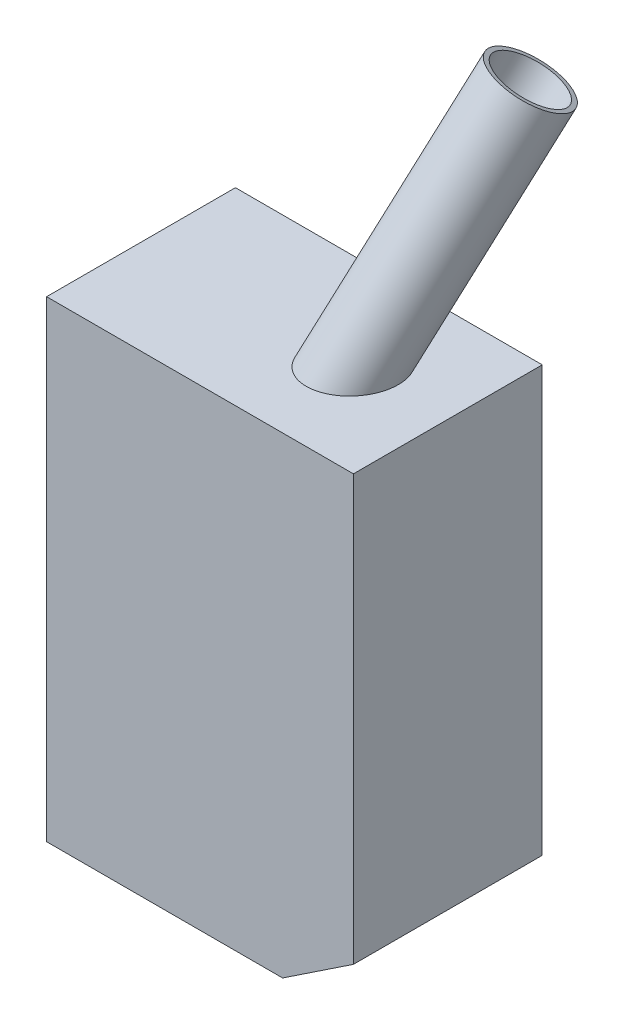
ISO-10303-21;
HEADER;
FILE_DESCRIPTION(('STEP AP214'),'2;1');
FILE_NAME('part.step','',(''),(''),'','','');
FILE_SCHEMA(('AUTOMOTIVE_DESIGN { 1 0 10303 214 1 1 1 1 }'));
ENDSEC;
DATA;
#1=APPLICATION_CONTEXT('core data for automotive mechanical design processes');
#2=APPLICATION_PROTOCOL_DEFINITION('international standard','automotive_design',2000,#1);
#3=PRODUCT_CONTEXT('',#1,'mechanical');
#4=PRODUCT('Part','Part','',(#3));
#5=PRODUCT_RELATED_PRODUCT_CATEGORY('part','',(#4));
#6=PRODUCT_DEFINITION_FORMATION('','',#4);
#7=PRODUCT_DEFINITION_CONTEXT('part definition',#1,'design');
#8=PRODUCT_DEFINITION('design','',#6,#7);
#9=PRODUCT_DEFINITION_SHAPE('','',#8);
#10=(LENGTH_UNIT() NAMED_UNIT(*) SI_UNIT(.MILLI.,.METRE.));
#11=(NAMED_UNIT(*) PLANE_ANGLE_UNIT() SI_UNIT($,.RADIAN.));
#12=(NAMED_UNIT(*) SI_UNIT($,.STERADIAN.) SOLID_ANGLE_UNIT());
#13=UNCERTAINTY_MEASURE_WITH_UNIT(LENGTH_MEASURE(1.E-05),#10,'distance_accuracy_value','');
#14=(GEOMETRIC_REPRESENTATION_CONTEXT(3) GLOBAL_UNCERTAINTY_ASSIGNED_CONTEXT((#13)) GLOBAL_UNIT_ASSIGNED_CONTEXT((#10,
#11,#12)) REPRESENTATION_CONTEXT('',''));
#15=CARTESIAN_POINT('',(0.,0.,0.));
#16=DIRECTION('',(0.,0.,1.));
#17=DIRECTION('',(1.,0.,0.));
#18=AXIS2_PLACEMENT_3D('',#15,#16,#17);
#19=CARTESIAN_POINT('',(82.55,254.,50.8));
#20=DIRECTION('',(-1.,0.,0.));
#21=DIRECTION('',(0.,0.,1.));
#22=AXIS2_PLACEMENT_3D('',#19,#20,#21);
#23=PLANE('',#22);
#24=DIRECTION('',(0.,-1.,0.));
#25=VECTOR('',#24,1.);
#26=CARTESIAN_POINT('',(82.55,254.,50.8));
#27=LINE('',#26,#25);
#28=CARTESIAN_POINT('',(82.55,254.,50.8));
#29=VERTEX_POINT('',#28);
#30=CARTESIAN_POINT('',(82.55,25.4,50.8));
#31=VERTEX_POINT('',#30);
#32=EDGE_CURVE('E233',#29,#31,#27,.T.);
#33=ORIENTED_EDGE('',*,*,#32,.T.);
#34=DIRECTION('',(0.,0.,-1.));
#35=VECTOR('',#34,1.);
#36=CARTESIAN_POINT('',(82.55,25.4,203.2));
#37=LINE('',#36,#35);
#38=CARTESIAN_POINT('',(82.55,25.4,-50.8));
#39=VERTEX_POINT('',#38);
#40=EDGE_CURVE('E215',#31,#39,#37,.T.);
#41=ORIENTED_EDGE('',*,*,#40,.T.);
#42=DIRECTION('',(0.,-1.,0.));
#43=VECTOR('',#42,1.);
#44=CARTESIAN_POINT('',(82.55,254.,-50.8));
#45=LINE('',#44,#43);
#46=CARTESIAN_POINT('',(82.55,254.,-50.8));
#47=VERTEX_POINT('',#46);
#48=EDGE_CURVE('E250',#47,#39,#45,.T.);
#49=ORIENTED_EDGE('',*,*,#48,.F.);
#50=DIRECTION('',(0.,0.,-1.));
#51=VECTOR('',#50,1.);
#52=CARTESIAN_POINT('',(82.55,254.,50.8));
#53=LINE('',#52,#51);
#54=EDGE_CURVE('E222',#29,#47,#53,.T.);
#55=ORIENTED_EDGE('',*,*,#54,.F.);
#56=EDGE_LOOP('',(#33,#41,#49,#55));
#57=FACE_BOUND('',#56,.T.);
#58=ADVANCED_FACE('F47',(#57),#23,.F.);
#59=CARTESIAN_POINT('',(-82.55,254.,-50.8));
#60=DIRECTION('',(0.,0.,1.));
#61=DIRECTION('',(1.,0.,0.));
#62=AXIS2_PLACEMENT_3D('',#59,#60,#61);
#63=PLANE('',#62);
#64=ORIENTED_EDGE('',*,*,#48,.T.);
#65=DIRECTION('',(0.832050294337844,0.554700196225229,0.));
#66=VECTOR('',#65,1.);
#67=CARTESIAN_POINT('',(44.45,0.,-50.8));
#68=LINE('',#67,#66);
#69=CARTESIAN_POINT('',(44.45,0.,-50.8));
#70=VERTEX_POINT('',#69);
#71=EDGE_CURVE('E212',#70,#39,#68,.T.);
#72=ORIENTED_EDGE('',*,*,#71,.F.);
#73=DIRECTION('',(-1.,0.,0.));
#74=VECTOR('',#73,1.);
#75=CARTESIAN_POINT('',(-82.55,0.,-50.8));
#76=LINE('',#75,#74);
#77=CARTESIAN_POINT('',(-82.55,0.,-50.8));
#78=VERTEX_POINT('',#77);
#79=EDGE_CURVE('E221',#70,#78,#76,.T.);
#80=ORIENTED_EDGE('',*,*,#79,.T.);
#81=DIRECTION('',(0.,-1.,0.));
#82=VECTOR('',#81,1.);
#83=CARTESIAN_POINT('',(-82.55,254.,-50.8));
#84=LINE('',#83,#82);
#85=CARTESIAN_POINT('',(-82.55,254.,-50.8));
#86=VERTEX_POINT('',#85);
#87=EDGE_CURVE('E247',#86,#78,#84,.T.);
#88=ORIENTED_EDGE('',*,*,#87,.F.);
#89=DIRECTION('',(-1.,0.,0.));
#90=VECTOR('',#89,1.);
#91=CARTESIAN_POINT('',(-82.55,254.,-50.8));
#92=LINE('',#91,#90);
#93=EDGE_CURVE('E95',#47,#86,#92,.T.);
#94=ORIENTED_EDGE('',*,*,#93,.F.);
#95=EDGE_LOOP('',(#64,#72,#80,#88,#94));
#96=FACE_BOUND('',#95,.T.);
#97=ADVANCED_FACE('F258',(#96),#63,.F.);
#98=CARTESIAN_POINT('',(-82.55,254.,50.8));
#99=DIRECTION('',(1.,0.,0.));
#100=DIRECTION('',(0.,0.,-1.));
#101=AXIS2_PLACEMENT_3D('',#98,#99,#100);
#102=PLANE('',#101);
#103=DIRECTION('',(0.,0.,1.));
#104=VECTOR('',#103,1.);
#105=CARTESIAN_POINT('',(-82.55,0.,50.8));
#106=LINE('',#105,#104);
#107=CARTESIAN_POINT('',(-82.55,0.,50.8));
#108=VERTEX_POINT('',#107);
#109=EDGE_CURVE('E87',#78,#108,#106,.T.);
#110=ORIENTED_EDGE('',*,*,#109,.T.);
#111=DIRECTION('',(0.,-1.,0.));
#112=VECTOR('',#111,1.);
#113=CARTESIAN_POINT('',(-82.55,254.,50.8));
#114=LINE('',#113,#112);
#115=CARTESIAN_POINT('',(-82.55,254.,50.8));
#116=VERTEX_POINT('',#115);
#117=EDGE_CURVE('E244',#116,#108,#114,.T.);
#118=ORIENTED_EDGE('',*,*,#117,.F.);
#119=DIRECTION('',(0.,0.,1.));
#120=VECTOR('',#119,1.);
#121=CARTESIAN_POINT('',(-82.55,254.,50.8));
#122=LINE('',#121,#120);
#123=EDGE_CURVE('E228',#86,#116,#122,.T.);
#124=ORIENTED_EDGE('',*,*,#123,.F.);
#125=ORIENTED_EDGE('',*,*,#87,.T.);
#126=EDGE_LOOP('',(#110,#118,#124,#125));
#127=FACE_BOUND('',#126,.T.);
#128=ADVANCED_FACE('F264',(#127),#102,.F.);
#129=CARTESIAN_POINT('',(-82.55,254.,50.8));
#130=DIRECTION('',(0.,0.,-1.));
#131=DIRECTION('',(-1.,0.,0.));
#132=AXIS2_PLACEMENT_3D('',#129,#130,#131);
#133=PLANE('',#132);
#134=DIRECTION('',(1.,0.,0.));
#135=VECTOR('',#134,1.);
#136=CARTESIAN_POINT('',(-82.55,0.,50.8));
#137=LINE('',#136,#135);
#138=CARTESIAN_POINT('',(44.45,0.,50.8));
#139=VERTEX_POINT('',#138);
#140=EDGE_CURVE('E225',#108,#139,#137,.T.);
#141=ORIENTED_EDGE('',*,*,#140,.T.);
#142=DIRECTION('',(0.832050294337844,0.554700196225229,0.));
#143=VECTOR('',#142,1.);
#144=CARTESIAN_POINT('',(73.7576923076923,19.5384615384615,50.8));
#145=LINE('',#144,#143);
#146=EDGE_CURVE('E62',#139,#31,#145,.T.);
#147=ORIENTED_EDGE('',*,*,#146,.T.);
#148=ORIENTED_EDGE('',*,*,#32,.F.);
#149=DIRECTION('',(1.,0.,0.));
#150=VECTOR('',#149,1.);
#151=CARTESIAN_POINT('',(-82.55,254.,50.8));
#152=LINE('',#151,#150);
#153=EDGE_CURVE('E71',#116,#29,#152,.T.);
#154=ORIENTED_EDGE('',*,*,#153,.F.);
#155=ORIENTED_EDGE('',*,*,#117,.T.);
#156=EDGE_LOOP('',(#141,#147,#148,#154,#155));
#157=FACE_BOUND('',#156,.T.);
#158=ADVANCED_FACE('F262',(#157),#133,.F.);
#159=CARTESIAN_POINT('',(0.,254.,0.));
#160=DIRECTION('',(0.,-1.,0.));
#161=DIRECTION('',(0.,0.,-1.));
#162=AXIS2_PLACEMENT_3D('',#159,#160,#161);
#163=PLANE('',#162);
#164=CARTESIAN_POINT('',(31.75,254.,0.));
#165=DIRECTION('',(0.,-1.,0.));
#166=DIRECTION('',(0.522261248166411,0.,-0.852785546701902));
#167=AXIS2_PLACEMENT_3D('',#164,#165,#166);
#168=ELLIPSE('',#167,23.5411071582636,20.447);
#169=CARTESIAN_POINT('',(44.044608007694,254.,-20.0755159379279));
#170=VERTEX_POINT('',#169);
#171=EDGE_CURVE('E11',#170,#170,#168,.T.);
#172=ORIENTED_EDGE('',*,*,#171,.T.);
#173=EDGE_LOOP('',(#172));
#174=FACE_BOUND('',#173,.T.);
#175=ORIENTED_EDGE('',*,*,#54,.T.);
#176=ORIENTED_EDGE('',*,*,#93,.T.);
#177=ORIENTED_EDGE('',*,*,#123,.T.);
#178=ORIENTED_EDGE('',*,*,#153,.T.);
#179=EDGE_LOOP('',(#175,#176,#177,#178));
#180=FACE_BOUND('',#179,.T.);
#181=ADVANCED_FACE('F265',(#174,#180),#163,.F.);
#182=CARTESIAN_POINT('',(0.,0.,0.));
#183=DIRECTION('',(0.,-1.,0.));
#184=DIRECTION('',(0.,0.,-1.));
#185=AXIS2_PLACEMENT_3D('',#182,#183,#184);
#186=PLANE('',#185);
#187=DIRECTION('',(0.,0.,-1.));
#188=VECTOR('',#187,1.);
#189=CARTESIAN_POINT('',(44.45,0.,0.));
#190=LINE('',#189,#188);
#191=EDGE_CURVE('E55',#139,#70,#190,.T.);
#192=ORIENTED_EDGE('',*,*,#191,.F.);
#193=ORIENTED_EDGE('',*,*,#140,.F.);
#194=ORIENTED_EDGE('',*,*,#109,.F.);
#195=ORIENTED_EDGE('',*,*,#79,.F.);
#196=EDGE_LOOP('',(#192,#193,#194,#195));
#197=FACE_BOUND('',#196,.T.);
#198=ADVANCED_FACE('F260',(#197),#186,.T.);
#199=CARTESIAN_POINT('',(44.45,0.,203.2));
#200=DIRECTION('',(-0.554700196225229,0.832050294337844,0.));
#201=DIRECTION('',(-0.832050294337844,-0.554700196225229,0.));
#202=AXIS2_PLACEMENT_3D('',#199,#200,#201);
#203=PLANE('',#202);
#204=ORIENTED_EDGE('',*,*,#191,.T.);
#205=ORIENTED_EDGE('',*,*,#71,.T.);
#206=ORIENTED_EDGE('',*,*,#40,.F.);
#207=ORIENTED_EDGE('',*,*,#146,.F.);
#208=EDGE_LOOP('',(#204,#205,#206,#207));
#209=FACE_BOUND('',#208,.T.);
#210=ADVANCED_FACE('F254',(#209),#203,.F.);
#211=CARTESIAN_POINT('',(15.6492353156836,199.96775843128,26.2904809840658));
#212=DIRECTION('',(0.258819045102518,0.868565775710448,-0.422618261740697));
#213=DIRECTION('',(0.,0.437526619786457,0.899205458712433));
#214=AXIS2_PLACEMENT_3D('',#211,#212,#213);
#215=CYLINDRICAL_SURFACE('',#214,20.447);
#216=CARTESIAN_POINT('',(67.9070206008218,375.33863886675,-59.0397711651754));
#217=DIRECTION('',(0.258819045102518,0.868565775710448,-0.422618261740697));
#218=DIRECTION('',(0.,0.437526619786457,0.899205458712433));
#219=AXIS2_PLACEMENT_3D('',#216,#217,#218);
#220=CIRCLE('',#219,20.447);
#221=CARTESIAN_POINT('',(67.9070206008218,384.284745661523,-40.6537171508823));
#222=VERTEX_POINT('',#221);
#223=EDGE_CURVE('E203',#222,#222,#220,.T.);
#224=ORIENTED_EDGE('',*,*,#223,.F.);
#225=EDGE_LOOP('',(#224));
#226=FACE_BOUND('',#225,.T.);
#227=ORIENTED_EDGE('',*,*,#171,.F.);
#228=EDGE_LOOP('',(#227));
#229=FACE_BOUND('',#228,.T.);
#230=ADVANCED_FACE('F286',(#226,#229),#215,.T.);
#231=CARTESIAN_POINT('',(67.9070206008218,375.33863886675,-59.0397711651754));
#232=DIRECTION('',(0.258819045102518,0.868565775710448,-0.422618261740697));
#233=DIRECTION('',(0.,0.437526619786457,0.899205458712433));
#234=AXIS2_PLACEMENT_3D('',#231,#232,#233);
#235=PLANE('',#234);
#236=CARTESIAN_POINT('',(67.9070206008218,375.33863886675,-59.0397711651754));
#237=DIRECTION('',(0.258819045102518,0.868565775710448,-0.422618261740697));
#238=DIRECTION('',(0.,0.437526619786457,0.899205458712433));
#239=AXIS2_PLACEMENT_3D('',#236,#237,#238);
#240=CIRCLE('',#239,17.907);
#241=CARTESIAN_POINT('',(67.9070206008218,383.173428047266,-42.9376990160119));
#242=VERTEX_POINT('',#241);
#243=EDGE_CURVE('E184',#242,#242,#240,.T.);
#244=ORIENTED_EDGE('',*,*,#243,.F.);
#245=EDGE_LOOP('',(#244));
#246=FACE_BOUND('',#245,.T.);
#247=ORIENTED_EDGE('',*,*,#223,.T.);
#248=EDGE_LOOP('',(#247));
#249=FACE_BOUND('',#248,.T.);
#250=ADVANCED_FACE('F289',(#246,#249),#235,.T.);
#251=CARTESIAN_POINT('',(80.01,254.,50.8));
#252=DIRECTION('',(-1.,0.,0.));
#253=DIRECTION('',(0.,0.,1.));
#254=AXIS2_PLACEMENT_3D('',#251,#252,#253);
#255=PLANE('',#254);
#256=DIRECTION('',(0.,-1.,0.));
#257=VECTOR('',#256,1.);
#258=CARTESIAN_POINT('',(80.01,254.,48.26));
#259=LINE('',#258,#257);
#260=CARTESIAN_POINT('',(80.01,251.46,48.26));
#261=VERTEX_POINT('',#260);
#262=CARTESIAN_POINT('',(80.01,26.7593667465595,48.26));
#263=VERTEX_POINT('',#262);
#264=EDGE_CURVE('E141',#261,#263,#259,.T.);
#265=ORIENTED_EDGE('',*,*,#264,.F.);
#266=DIRECTION('',(0.,0.,-1.));
#267=VECTOR('',#266,1.);
#268=CARTESIAN_POINT('',(80.01,251.46,0.));
#269=LINE('',#268,#267);
#270=CARTESIAN_POINT('',(80.01,251.46,-48.26));
#271=VERTEX_POINT('',#270);
#272=EDGE_CURVE('E177',#261,#271,#269,.T.);
#273=ORIENTED_EDGE('',*,*,#272,.T.);
#274=DIRECTION('',(0.,-1.,0.));
#275=VECTOR('',#274,1.);
#276=CARTESIAN_POINT('',(80.01,254.,-48.26));
#277=LINE('',#276,#275);
#278=CARTESIAN_POINT('',(80.01,26.7593667465595,-48.26));
#279=VERTEX_POINT('',#278);
#280=EDGE_CURVE('E144',#271,#279,#277,.T.);
#281=ORIENTED_EDGE('',*,*,#280,.T.);
#282=DIRECTION('',(0.,0.,-1.));
#283=VECTOR('',#282,1.);
#284=CARTESIAN_POINT('',(80.01,26.7593667465595,50.8));
#285=LINE('',#284,#283);
#286=EDGE_CURVE('E136',#263,#279,#285,.T.);
#287=ORIENTED_EDGE('',*,*,#286,.F.);
#288=EDGE_LOOP('',(#265,#273,#281,#287));
#289=FACE_BOUND('',#288,.T.);
#290=ADVANCED_FACE('F138',(#289),#255,.T.);
#291=CARTESIAN_POINT('',(-82.55,254.,-48.26));
#292=DIRECTION('',(0.,0.,1.));
#293=DIRECTION('',(1.,0.,0.));
#294=AXIS2_PLACEMENT_3D('',#291,#292,#293);
#295=PLANE('',#294);
#296=ORIENTED_EDGE('',*,*,#280,.F.);
#297=DIRECTION('',(-1.,0.,0.));
#298=VECTOR('',#297,1.);
#299=CARTESIAN_POINT('',(0.,251.46,-48.26));
#300=LINE('',#299,#298);
#301=CARTESIAN_POINT('',(-80.01,251.46,-48.26));
#302=VERTEX_POINT('',#301);
#303=EDGE_CURVE('E180',#271,#302,#300,.T.);
#304=ORIENTED_EDGE('',*,*,#303,.T.);
#305=DIRECTION('',(0.,-1.,0.));
#306=VECTOR('',#305,1.);
#307=CARTESIAN_POINT('',(-80.01,254.,-48.26));
#308=LINE('',#307,#306);
#309=CARTESIAN_POINT('',(-80.01,2.54,-48.26));
#310=VERTEX_POINT('',#309);
#311=EDGE_CURVE('E170',#302,#310,#308,.T.);
#312=ORIENTED_EDGE('',*,*,#311,.T.);
#313=DIRECTION('',(-1.,0.,0.));
#314=VECTOR('',#313,1.);
#315=CARTESIAN_POINT('',(0.,2.54,-48.26));
#316=LINE('',#315,#314);
#317=CARTESIAN_POINT('',(43.6809498801607,2.54,-48.26));
#318=VERTEX_POINT('',#317);
#319=EDGE_CURVE('E158',#318,#310,#316,.T.);
#320=ORIENTED_EDGE('',*,*,#319,.F.);
#321=DIRECTION('',(0.832050294337844,0.554700196225229,0.));
#322=VECTOR('',#321,1.);
#323=CARTESIAN_POINT('',(43.0410615015879,2.11340774761812,-48.26));
#324=LINE('',#323,#322);
#325=EDGE_CURVE('E149',#318,#279,#324,.T.);
#326=ORIENTED_EDGE('',*,*,#325,.T.);
#327=EDGE_LOOP('',(#296,#304,#312,#320,#326));
#328=FACE_BOUND('',#327,.T.);
#329=ADVANCED_FACE('F313',(#328),#295,.T.);
#330=CARTESIAN_POINT('',(-80.01,254.,50.8));
#331=DIRECTION('',(1.,0.,0.));
#332=DIRECTION('',(0.,0.,-1.));
#333=AXIS2_PLACEMENT_3D('',#330,#331,#332);
#334=PLANE('',#333);
#335=DIRECTION('',(0.,0.,1.));
#336=VECTOR('',#335,1.);
#337=CARTESIAN_POINT('',(-80.01,2.54,0.));
#338=LINE('',#337,#336);
#339=CARTESIAN_POINT('',(-80.01,2.54,48.26));
#340=VERTEX_POINT('',#339);
#341=EDGE_CURVE('E187',#310,#340,#338,.T.);
#342=ORIENTED_EDGE('',*,*,#341,.F.);
#343=ORIENTED_EDGE('',*,*,#311,.F.);
#344=DIRECTION('',(0.,0.,1.));
#345=VECTOR('',#344,1.);
#346=CARTESIAN_POINT('',(-80.01,251.46,0.));
#347=LINE('',#346,#345);
#348=CARTESIAN_POINT('',(-80.01,251.46,48.26));
#349=VERTEX_POINT('',#348);
#350=EDGE_CURVE('E172',#302,#349,#347,.T.);
#351=ORIENTED_EDGE('',*,*,#350,.T.);
#352=DIRECTION('',(0.,-1.,0.));
#353=VECTOR('',#352,1.);
#354=CARTESIAN_POINT('',(-80.01,254.,48.26));
#355=LINE('',#354,#353);
#356=EDGE_CURVE('E165',#349,#340,#355,.T.);
#357=ORIENTED_EDGE('',*,*,#356,.T.);
#358=EDGE_LOOP('',(#342,#343,#351,#357));
#359=FACE_BOUND('',#358,.T.);
#360=ADVANCED_FACE('F310',(#359),#334,.T.);
#361=CARTESIAN_POINT('',(-82.55,254.,48.26));
#362=DIRECTION('',(0.,0.,-1.));
#363=DIRECTION('',(-1.,0.,0.));
#364=AXIS2_PLACEMENT_3D('',#361,#362,#363);
#365=PLANE('',#364);
#366=DIRECTION('',(1.,0.,0.));
#367=VECTOR('',#366,1.);
#368=CARTESIAN_POINT('',(0.,2.54,48.26));
#369=LINE('',#368,#367);
#370=CARTESIAN_POINT('',(43.6809498801607,2.54,48.26));
#371=VERTEX_POINT('',#370);
#372=EDGE_CURVE('E181',#340,#371,#369,.T.);
#373=ORIENTED_EDGE('',*,*,#372,.F.);
#374=ORIENTED_EDGE('',*,*,#356,.F.);
#375=DIRECTION('',(1.,0.,0.));
#376=VECTOR('',#375,1.);
#377=CARTESIAN_POINT('',(0.,251.46,48.26));
#378=LINE('',#377,#376);
#379=EDGE_CURVE('E163',#349,#261,#378,.T.);
#380=ORIENTED_EDGE('',*,*,#379,.T.);
#381=ORIENTED_EDGE('',*,*,#264,.T.);
#382=DIRECTION('',(0.832050294337844,0.554700196225229,0.));
#383=VECTOR('',#382,1.);
#384=CARTESIAN_POINT('',(72.3487538092802,21.6518692860797,48.26));
#385=LINE('',#384,#383);
#386=EDGE_CURVE('E148',#371,#263,#385,.T.);
#387=ORIENTED_EDGE('',*,*,#386,.F.);
#388=EDGE_LOOP('',(#373,#374,#380,#381,#387));
#389=FACE_BOUND('',#388,.T.);
#390=ADVANCED_FACE('F160',(#389),#365,.T.);
#391=CARTESIAN_POINT('',(0.,251.46,0.));
#392=DIRECTION('',(0.,-1.,0.));
#393=DIRECTION('',(0.,0.,-1.));
#394=AXIS2_PLACEMENT_3D('',#391,#392,#393);
#395=PLANE('',#394);
#396=CARTESIAN_POINT('',(30.9931196428127,251.46,1.2358884207052));
#397=DIRECTION('',(0.,-1.,0.));
#398=DIRECTION('',(0.522261248166411,0.,-0.852785546701902));
#399=AXIS2_PLACEMENT_3D('',#396,#397,#398);
#400=ELLIPSE('',#399,20.6167460205911,17.907);
#401=CARTESIAN_POINT('',(41.7604471526565,251.46,-16.3457746056788));
#402=VERTEX_POINT('',#401);
#403=EDGE_CURVE('E199',#402,#402,#400,.T.);
#404=ORIENTED_EDGE('',*,*,#403,.F.);
#405=EDGE_LOOP('',(#404));
#406=FACE_BOUND('',#405,.T.);
#407=ORIENTED_EDGE('',*,*,#272,.F.);
#408=ORIENTED_EDGE('',*,*,#379,.F.);
#409=ORIENTED_EDGE('',*,*,#350,.F.);
#410=ORIENTED_EDGE('',*,*,#303,.F.);
#411=EDGE_LOOP('',(#407,#408,#409,#410));
#412=FACE_BOUND('',#411,.T.);
#413=ADVANCED_FACE('F303',(#406,#412),#395,.T.);
#414=CARTESIAN_POINT('',(0.,2.54,0.));
#415=DIRECTION('',(0.,-1.,0.));
#416=DIRECTION('',(0.,0.,-1.));
#417=AXIS2_PLACEMENT_3D('',#414,#415,#416);
#418=PLANE('',#417);
#419=DIRECTION('',(0.,0.,-1.));
#420=VECTOR('',#419,1.);
#421=CARTESIAN_POINT('',(43.6809498801607,2.54,0.));
#422=LINE('',#421,#420);
#423=EDGE_CURVE('E153',#371,#318,#422,.T.);
#424=ORIENTED_EDGE('',*,*,#423,.T.);
#425=ORIENTED_EDGE('',*,*,#319,.T.);
#426=ORIENTED_EDGE('',*,*,#341,.T.);
#427=ORIENTED_EDGE('',*,*,#372,.T.);
#428=EDGE_LOOP('',(#424,#425,#426,#427));
#429=FACE_BOUND('',#428,.T.);
#430=ADVANCED_FACE('F300',(#429),#418,.F.);
#431=CARTESIAN_POINT('',(43.0410615015879,2.11340774761812,203.2));
#432=DIRECTION('',(-0.554700196225229,0.832050294337844,0.));
#433=DIRECTION('',(-0.832050294337844,-0.554700196225229,0.));
#434=AXIS2_PLACEMENT_3D('',#431,#432,#433);
#435=PLANE('',#434);
#436=ORIENTED_EDGE('',*,*,#423,.F.);
#437=ORIENTED_EDGE('',*,*,#386,.T.);
#438=ORIENTED_EDGE('',*,*,#286,.T.);
#439=ORIENTED_EDGE('',*,*,#325,.F.);
#440=EDGE_LOOP('',(#436,#437,#438,#439));
#441=FACE_BOUND('',#440,.T.);
#442=ADVANCED_FACE('F152',(#441),#435,.T.);
#443=CARTESIAN_POINT('',(15.6492353156836,199.96775843128,26.2904809840658));
#444=DIRECTION('',(0.258819045102518,0.868565775710448,-0.422618261740697));
#445=DIRECTION('',(0.,0.437526619786457,0.899205458712433));
#446=AXIS2_PLACEMENT_3D('',#443,#444,#445);
#447=CYLINDRICAL_SURFACE('',#446,17.907);
#448=ORIENTED_EDGE('',*,*,#243,.T.);
#449=EDGE_LOOP('',(#448));
#450=FACE_BOUND('',#449,.T.);
#451=ORIENTED_EDGE('',*,*,#403,.T.);
#452=EDGE_LOOP('',(#451));
#453=FACE_BOUND('',#452,.T.);
#454=ADVANCED_FACE('F294',(#450,#453),#447,.F.);
#455=CLOSED_SHELL('',(#58,#97,#128,#158,#181,#198,#210,#230,#250,#290,#329,#360,#390,#413,#430,
#442,#454));
#456=MANIFOLD_SOLID_BREP('B2',#455);
#457=ADVANCED_BREP_SHAPE_REPRESENTATION('',(#18,#456),#14);
#458=SHAPE_DEFINITION_REPRESENTATION(#9,#457);
ENDSEC;
END-ISO-10303-21;
